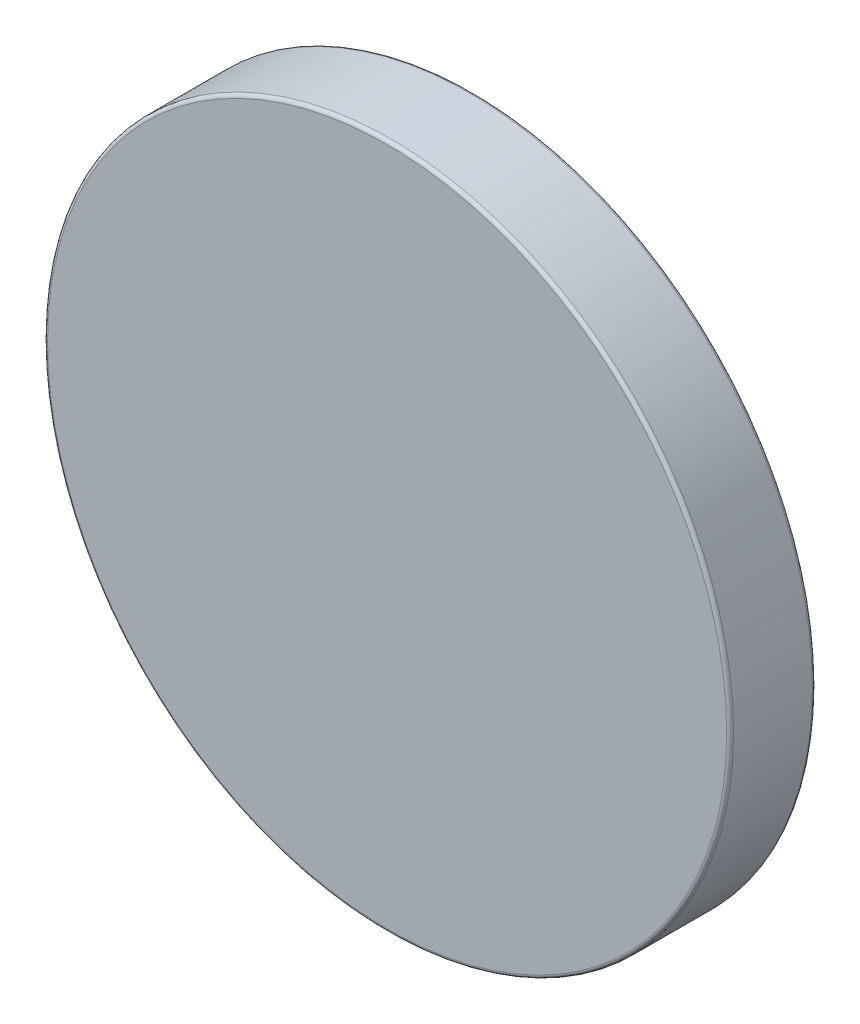
ISO-10303-21;
HEADER;
FILE_DESCRIPTION(('STEP AP214'),'2;1');
FILE_NAME('part.step','',(''),(''),'','','');
FILE_SCHEMA(('AUTOMOTIVE_DESIGN { 1 0 10303 214 1 1 1 1 }'));
ENDSEC;
DATA;
#1=APPLICATION_CONTEXT('core data for automotive mechanical design processes');
#2=APPLICATION_PROTOCOL_DEFINITION('international standard','automotive_design',2000,#1);
#3=PRODUCT_CONTEXT('',#1,'mechanical');
#4=PRODUCT('Part','Part','',(#3));
#5=PRODUCT_RELATED_PRODUCT_CATEGORY('part','',(#4));
#6=PRODUCT_DEFINITION_FORMATION('','',#4);
#7=PRODUCT_DEFINITION_CONTEXT('part definition',#1,'design');
#8=PRODUCT_DEFINITION('design','',#6,#7);
#9=PRODUCT_DEFINITION_SHAPE('','',#8);
#10=(LENGTH_UNIT() NAMED_UNIT(*) SI_UNIT(.MILLI.,.METRE.));
#11=(NAMED_UNIT(*) PLANE_ANGLE_UNIT() SI_UNIT($,.RADIAN.));
#12=(NAMED_UNIT(*) SI_UNIT($,.STERADIAN.) SOLID_ANGLE_UNIT());
#13=UNCERTAINTY_MEASURE_WITH_UNIT(LENGTH_MEASURE(1.E-05),#10,'distance_accuracy_value','');
#14=(GEOMETRIC_REPRESENTATION_CONTEXT(3) GLOBAL_UNCERTAINTY_ASSIGNED_CONTEXT((#13)) GLOBAL_UNIT_ASSIGNED_CONTEXT((#10,
#11,#12)) REPRESENTATION_CONTEXT('',''));
#15=CARTESIAN_POINT('',(0.,0.,0.));
#16=DIRECTION('',(0.,0.,1.));
#17=DIRECTION('',(1.,0.,0.));
#18=AXIS2_PLACEMENT_3D('',#15,#16,#17);
#19=CARTESIAN_POINT('',(0.,0.,1.5875));
#20=DIRECTION('',(0.,0.,-1.));
#21=DIRECTION('',(-1.,0.,0.));
#22=AXIS2_PLACEMENT_3D('',#19,#20,#21);
#23=CYLINDRICAL_SURFACE('',#22,12.7);
#24=CARTESIAN_POINT('',(0.,0.,-1.4605));
#25=DIRECTION('',(0.,0.,1.));
#26=DIRECTION('',(1.,0.,0.));
#27=AXIS2_PLACEMENT_3D('',#24,#25,#26);
#28=CIRCLE('',#27,12.7);
#29=CARTESIAN_POINT('',(12.7,0.,-1.4605));
#30=VERTEX_POINT('',#29);
#31=EDGE_CURVE('E46',#30,#30,#28,.T.);
#32=ORIENTED_EDGE('',*,*,#31,.T.);
#33=EDGE_LOOP('',(#32));
#34=FACE_BOUND('',#33,.T.);
#35=CARTESIAN_POINT('',(0.,0.,1.4605));
#36=DIRECTION('',(0.,0.,1.));
#37=DIRECTION('',(1.,0.,0.));
#38=AXIS2_PLACEMENT_3D('',#35,#36,#37);
#39=CIRCLE('',#38,12.7);
#40=CARTESIAN_POINT('',(12.7,0.,1.4605));
#41=VERTEX_POINT('',#40);
#42=EDGE_CURVE('E50',#41,#41,#39,.F.);
#43=ORIENTED_EDGE('',*,*,#42,.T.);
#44=EDGE_LOOP('',(#43));
#45=FACE_BOUND('',#44,.T.);
#46=ADVANCED_FACE('F35',(#34,#45),#23,.T.);
#47=CARTESIAN_POINT('',(0.,0.,1.5875));
#48=DIRECTION('',(0.,0.,1.));
#49=DIRECTION('',(1.,0.,0.));
#50=AXIS2_PLACEMENT_3D('',#47,#48,#49);
#51=PLANE('',#50);
#52=CARTESIAN_POINT('',(0.,0.,1.5875));
#53=DIRECTION('',(0.,0.,1.));
#54=DIRECTION('',(1.,0.,0.));
#55=AXIS2_PLACEMENT_3D('',#52,#53,#54);
#56=CIRCLE('',#55,12.573);
#57=CARTESIAN_POINT('',(12.573,0.,1.5875));
#58=VERTEX_POINT('',#57);
#59=EDGE_CURVE('E10',#58,#58,#56,.T.);
#60=ORIENTED_EDGE('',*,*,#59,.T.);
#61=EDGE_LOOP('',(#60));
#62=FACE_BOUND('',#61,.T.);
#63=ADVANCED_FACE('F66',(#62),#51,.T.);
#64=CARTESIAN_POINT('',(0.,0.,-1.5875));
#65=DIRECTION('',(0.,0.,1.));
#66=DIRECTION('',(1.,0.,0.));
#67=AXIS2_PLACEMENT_3D('',#64,#65,#66);
#68=PLANE('',#67);
#69=CARTESIAN_POINT('',(0.,0.,-1.5875));
#70=DIRECTION('',(0.,0.,1.));
#71=DIRECTION('',(1.,0.,0.));
#72=AXIS2_PLACEMENT_3D('',#69,#70,#71);
#73=CIRCLE('',#72,12.573);
#74=CARTESIAN_POINT('',(12.573,0.,-1.5875));
#75=VERTEX_POINT('',#74);
#76=EDGE_CURVE('E42',#75,#75,#73,.F.);
#77=ORIENTED_EDGE('',*,*,#76,.T.);
#78=EDGE_LOOP('',(#77));
#79=FACE_BOUND('',#78,.T.);
#80=ADVANCED_FACE('F63',(#79),#68,.F.);
#81=CARTESIAN_POINT('',(0.,0.,-1.4605));
#82=DIRECTION('',(0.,0.,1.));
#83=DIRECTION('',(1.,0.,0.));
#84=AXIS2_PLACEMENT_3D('',#81,#82,#83);
#85=TOROIDAL_SURFACE('',#84,12.573,0.127);
#86=ORIENTED_EDGE('',*,*,#76,.F.);
#87=EDGE_LOOP('',(#86));
#88=FACE_BOUND('',#87,.T.);
#89=ORIENTED_EDGE('',*,*,#31,.F.);
#90=EDGE_LOOP('',(#89));
#91=FACE_BOUND('',#90,.T.);
#92=ADVANCED_FACE('F59',(#88,#91),#85,.T.);
#93=CARTESIAN_POINT('',(0.,0.,1.4605));
#94=DIRECTION('',(0.,0.,1.));
#95=DIRECTION('',(1.,0.,0.));
#96=AXIS2_PLACEMENT_3D('',#93,#94,#95);
#97=TOROIDAL_SURFACE('',#96,12.573,0.127);
#98=ORIENTED_EDGE('',*,*,#42,.F.);
#99=EDGE_LOOP('',(#98));
#100=FACE_BOUND('',#99,.T.);
#101=ORIENTED_EDGE('',*,*,#59,.F.);
#102=EDGE_LOOP('',(#101));
#103=FACE_BOUND('',#102,.T.);
#104=ADVANCED_FACE('F37',(#100,#103),#97,.T.);
#105=CLOSED_SHELL('',(#46,#63,#80,#92,#104));
#106=MANIFOLD_SOLID_BREP('B2',#105);
#107=ADVANCED_BREP_SHAPE_REPRESENTATION('',(#18,#106),#14);
#108=SHAPE_DEFINITION_REPRESENTATION(#9,#107);
ENDSEC;
END-ISO-10303-21;
